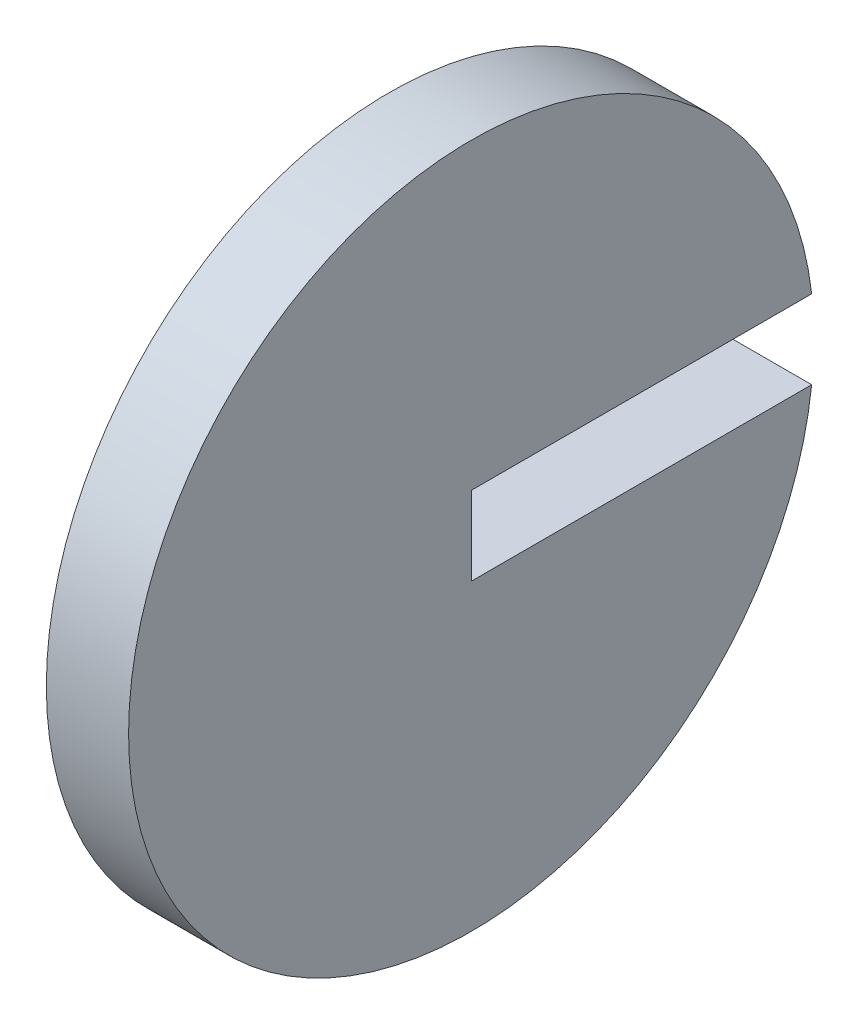
ISO-10303-21;
HEADER;
FILE_DESCRIPTION(('STEP AP214'),'2;1');
FILE_NAME('part.step','',(''),(''),'','','');
FILE_SCHEMA(('AUTOMOTIVE_DESIGN { 1 0 10303 214 1 1 1 1 }'));
ENDSEC;
DATA;
#1=APPLICATION_CONTEXT('core data for automotive mechanical design processes');
#2=APPLICATION_PROTOCOL_DEFINITION('international standard','automotive_design',2000,#1);
#3=PRODUCT_CONTEXT('',#1,'mechanical');
#4=PRODUCT('Part','Part','',(#3));
#5=PRODUCT_RELATED_PRODUCT_CATEGORY('part','',(#4));
#6=PRODUCT_DEFINITION_FORMATION('','',#4);
#7=PRODUCT_DEFINITION_CONTEXT('part definition',#1,'design');
#8=PRODUCT_DEFINITION('design','',#6,#7);
#9=PRODUCT_DEFINITION_SHAPE('','',#8);
#10=(LENGTH_UNIT() NAMED_UNIT(*) SI_UNIT(.MILLI.,.METRE.));
#11=(NAMED_UNIT(*) PLANE_ANGLE_UNIT() SI_UNIT($,.RADIAN.));
#12=(NAMED_UNIT(*) SI_UNIT($,.STERADIAN.) SOLID_ANGLE_UNIT());
#13=UNCERTAINTY_MEASURE_WITH_UNIT(LENGTH_MEASURE(1.E-05),#10,'distance_accuracy_value','');
#14=(GEOMETRIC_REPRESENTATION_CONTEXT(3) GLOBAL_UNCERTAINTY_ASSIGNED_CONTEXT((#13)) GLOBAL_UNIT_ASSIGNED_CONTEXT((#10,
#11,#12)) REPRESENTATION_CONTEXT('',''));
#15=CARTESIAN_POINT('',(0.,0.,0.));
#16=DIRECTION('',(0.,0.,1.));
#17=DIRECTION('',(1.,0.,0.));
#18=AXIS2_PLACEMENT_3D('',#15,#16,#17);
#19=CARTESIAN_POINT('',(3.,0.,0.));
#20=DIRECTION('',(-1.,0.,0.));
#21=DIRECTION('',(0.,0.,1.));
#22=AXIS2_PLACEMENT_3D('',#19,#20,#21);
#23=CYLINDRICAL_SURFACE('',#22,12.5);
#24=CARTESIAN_POINT('',(0.,0.,0.));
#25=DIRECTION('',(1.,0.,0.));
#26=DIRECTION('',(0.,0.,-1.));
#27=AXIS2_PLACEMENT_3D('',#24,#25,#26);
#28=CIRCLE('',#27,12.5);
#29=CARTESIAN_POINT('',(0.,1.435,-12.4173578107422));
#30=VERTEX_POINT('',#29);
#31=CARTESIAN_POINT('',(0.,-1.435,-12.4173578107422));
#32=VERTEX_POINT('',#31);
#33=EDGE_CURVE('E99',#30,#32,#28,.T.);
#34=ORIENTED_EDGE('',*,*,#33,.T.);
#35=DIRECTION('',(-1.,0.,0.));
#36=VECTOR('',#35,1.);
#37=CARTESIAN_POINT('',(3.,-1.435,-12.4173578107422));
#38=LINE('',#37,#36);
#39=CARTESIAN_POINT('',(3.,-1.435,-12.4173578107422));
#40=VERTEX_POINT('',#39);
#41=EDGE_CURVE('E55',#32,#40,#38,.F.);
#42=ORIENTED_EDGE('',*,*,#41,.T.);
#43=CARTESIAN_POINT('',(3.,0.,0.));
#44=DIRECTION('',(1.,0.,0.));
#45=DIRECTION('',(0.,0.,-1.));
#46=AXIS2_PLACEMENT_3D('',#43,#44,#45);
#47=CIRCLE('',#46,12.5);
#48=CARTESIAN_POINT('',(3.,1.435,-12.4173578107422));
#49=VERTEX_POINT('',#48);
#50=EDGE_CURVE('E40',#49,#40,#47,.T.);
#51=ORIENTED_EDGE('',*,*,#50,.F.);
#52=DIRECTION('',(-1.,0.,0.));
#53=VECTOR('',#52,1.);
#54=CARTESIAN_POINT('',(3.,1.435,-12.4173578107422));
#55=LINE('',#54,#53);
#56=EDGE_CURVE('E78',#49,#30,#55,.T.);
#57=ORIENTED_EDGE('',*,*,#56,.T.);
#58=EDGE_LOOP('',(#34,#42,#51,#57));
#59=FACE_BOUND('',#58,.T.);
#60=ADVANCED_FACE('F33',(#59),#23,.T.);
#61=CARTESIAN_POINT('',(3.,0.,0.));
#62=DIRECTION('',(1.,0.,0.));
#63=DIRECTION('',(0.,0.,-1.));
#64=AXIS2_PLACEMENT_3D('',#61,#62,#63);
#65=PLANE('',#64);
#66=DIRECTION('',(0.,0.,-1.));
#67=VECTOR('',#66,1.);
#68=CARTESIAN_POINT('',(3.,-1.435,0.));
#69=LINE('',#68,#67);
#70=CARTESIAN_POINT('',(3.,-1.435,0.));
#71=VERTEX_POINT('',#70);
#72=EDGE_CURVE('E88',#71,#40,#69,.T.);
#73=ORIENTED_EDGE('',*,*,#72,.F.);
#74=DIRECTION('',(0.,-1.,0.));
#75=VECTOR('',#74,1.);
#76=CARTESIAN_POINT('',(3.,-1.435,0.));
#77=LINE('',#76,#75);
#78=CARTESIAN_POINT('',(3.,1.435,0.));
#79=VERTEX_POINT('',#78);
#80=EDGE_CURVE('E76',#79,#71,#77,.T.);
#81=ORIENTED_EDGE('',*,*,#80,.F.);
#82=DIRECTION('',(0.,0.,1.));
#83=VECTOR('',#82,1.);
#84=CARTESIAN_POINT('',(3.,1.435,0.));
#85=LINE('',#84,#83);
#86=EDGE_CURVE('E92',#49,#79,#85,.T.);
#87=ORIENTED_EDGE('',*,*,#86,.F.);
#88=ORIENTED_EDGE('',*,*,#50,.T.);
#89=EDGE_LOOP('',(#73,#81,#87,#88));
#90=FACE_BOUND('',#89,.T.);
#91=ADVANCED_FACE('F107',(#90),#65,.T.);
#92=CARTESIAN_POINT('',(0.,0.,0.));
#93=DIRECTION('',(1.,0.,0.));
#94=DIRECTION('',(0.,0.,-1.));
#95=AXIS2_PLACEMENT_3D('',#92,#93,#94);
#96=PLANE('',#95);
#97=DIRECTION('',(0.,-1.,0.));
#98=VECTOR('',#97,1.);
#99=CARTESIAN_POINT('',(0.,-1.435,0.));
#100=LINE('',#99,#98);
#101=CARTESIAN_POINT('',(0.,1.435,0.));
#102=VERTEX_POINT('',#101);
#103=CARTESIAN_POINT('',(0.,-1.435,0.));
#104=VERTEX_POINT('',#103);
#105=EDGE_CURVE('E47',#102,#104,#100,.T.);
#106=ORIENTED_EDGE('',*,*,#105,.T.);
#107=DIRECTION('',(0.,0.,-1.));
#108=VECTOR('',#107,1.);
#109=CARTESIAN_POINT('',(0.,-1.435,0.));
#110=LINE('',#109,#108);
#111=EDGE_CURVE('E81',#104,#32,#110,.T.);
#112=ORIENTED_EDGE('',*,*,#111,.T.);
#113=ORIENTED_EDGE('',*,*,#33,.F.);
#114=DIRECTION('',(0.,0.,1.));
#115=VECTOR('',#114,1.);
#116=CARTESIAN_POINT('',(0.,1.435,0.));
#117=LINE('',#116,#115);
#118=EDGE_CURVE('E11',#30,#102,#117,.T.);
#119=ORIENTED_EDGE('',*,*,#118,.T.);
#120=EDGE_LOOP('',(#106,#112,#113,#119));
#121=FACE_BOUND('',#120,.T.);
#122=ADVANCED_FACE('F87',(#121),#96,.F.);
#123=CARTESIAN_POINT('',(0.,-1.435,0.));
#124=DIRECTION('',(0.,-1.,0.));
#125=DIRECTION('',(0.,0.,-1.));
#126=AXIS2_PLACEMENT_3D('',#123,#124,#125);
#127=PLANE('',#126);
#128=ORIENTED_EDGE('',*,*,#111,.F.);
#129=DIRECTION('',(1.,0.,0.));
#130=VECTOR('',#129,1.);
#131=CARTESIAN_POINT('',(0.,-1.435,0.));
#132=LINE('',#131,#130);
#133=EDGE_CURVE('E73',#104,#71,#132,.T.);
#134=ORIENTED_EDGE('',*,*,#133,.T.);
#135=ORIENTED_EDGE('',*,*,#72,.T.);
#136=ORIENTED_EDGE('',*,*,#41,.F.);
#137=EDGE_LOOP('',(#128,#134,#135,#136));
#138=FACE_BOUND('',#137,.T.);
#139=ADVANCED_FACE('F82',(#138),#127,.F.);
#140=CARTESIAN_POINT('',(0.,1.435,0.));
#141=DIRECTION('',(0.,1.,0.));
#142=DIRECTION('',(0.,0.,1.));
#143=AXIS2_PLACEMENT_3D('',#140,#141,#142);
#144=PLANE('',#143);
#145=ORIENTED_EDGE('',*,*,#86,.T.);
#146=DIRECTION('',(1.,0.,0.));
#147=VECTOR('',#146,1.);
#148=CARTESIAN_POINT('',(0.,1.435,0.));
#149=LINE('',#148,#147);
#150=EDGE_CURVE('E79',#102,#79,#149,.T.);
#151=ORIENTED_EDGE('',*,*,#150,.F.);
#152=ORIENTED_EDGE('',*,*,#118,.F.);
#153=ORIENTED_EDGE('',*,*,#56,.F.);
#154=EDGE_LOOP('',(#145,#151,#152,#153));
#155=FACE_BOUND('',#154,.T.);
#156=ADVANCED_FACE('F105',(#155),#144,.F.);
#157=CARTESIAN_POINT('',(0.,-1.435,0.));
#158=DIRECTION('',(0.,0.,1.));
#159=DIRECTION('',(1.,0.,0.));
#160=AXIS2_PLACEMENT_3D('',#157,#158,#159);
#161=PLANE('',#160);
#162=ORIENTED_EDGE('',*,*,#80,.T.);
#163=ORIENTED_EDGE('',*,*,#133,.F.);
#164=ORIENTED_EDGE('',*,*,#105,.F.);
#165=ORIENTED_EDGE('',*,*,#150,.T.);
#166=EDGE_LOOP('',(#162,#163,#164,#165));
#167=FACE_BOUND('',#166,.T.);
#168=ADVANCED_FACE('F74',(#167),#161,.F.);
#169=CLOSED_SHELL('',(#60,#91,#122,#139,#156,#168));
#170=MANIFOLD_SOLID_BREP('B2',#169);
#171=ADVANCED_BREP_SHAPE_REPRESENTATION('',(#18,#170),#14);
#172=SHAPE_DEFINITION_REPRESENTATION(#9,#171);
ENDSEC;
END-ISO-10303-21;
